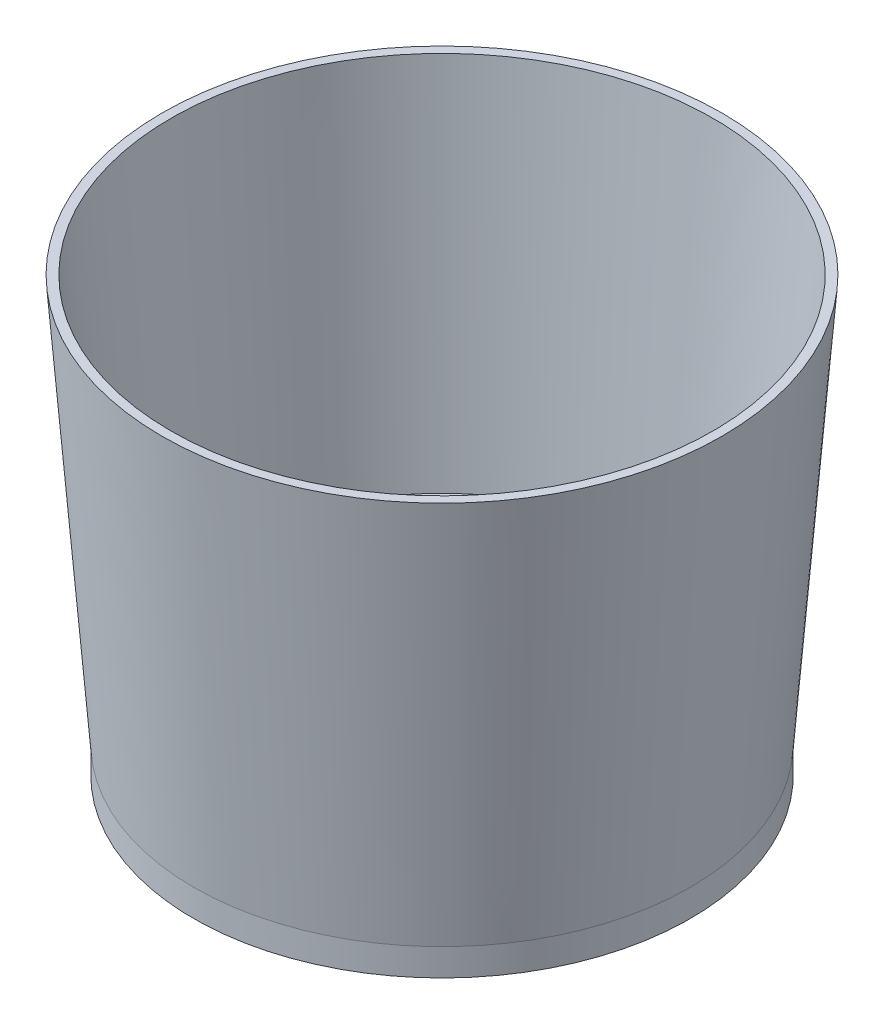
ISO-10303-21;
HEADER;
FILE_DESCRIPTION(('STEP AP214'),'2;1');
FILE_NAME('part.step','',(''),(''),'','','');
FILE_SCHEMA(('AUTOMOTIVE_DESIGN { 1 0 10303 214 1 1 1 1 }'));
ENDSEC;
DATA;
#1=APPLICATION_CONTEXT('core data for automotive mechanical design processes');
#2=APPLICATION_PROTOCOL_DEFINITION('international standard','automotive_design',2000,#1);
#3=PRODUCT_CONTEXT('',#1,'mechanical');
#4=PRODUCT('Part','Part','',(#3));
#5=PRODUCT_RELATED_PRODUCT_CATEGORY('part','',(#4));
#6=PRODUCT_DEFINITION_FORMATION('','',#4);
#7=PRODUCT_DEFINITION_CONTEXT('part definition',#1,'design');
#8=PRODUCT_DEFINITION('design','',#6,#7);
#9=PRODUCT_DEFINITION_SHAPE('','',#8);
#10=(LENGTH_UNIT() NAMED_UNIT(*) SI_UNIT(.MILLI.,.METRE.));
#11=(NAMED_UNIT(*) PLANE_ANGLE_UNIT() SI_UNIT($,.RADIAN.));
#12=(NAMED_UNIT(*) SI_UNIT($,.STERADIAN.) SOLID_ANGLE_UNIT());
#13=UNCERTAINTY_MEASURE_WITH_UNIT(LENGTH_MEASURE(1.E-05),#10,'distance_accuracy_value','');
#14=(GEOMETRIC_REPRESENTATION_CONTEXT(3) GLOBAL_UNCERTAINTY_ASSIGNED_CONTEXT((#13)) GLOBAL_UNIT_ASSIGNED_CONTEXT((#10,
#11,#12)) REPRESENTATION_CONTEXT('',''));
#15=CARTESIAN_POINT('',(0.,0.,0.));
#16=DIRECTION('',(0.,0.,1.));
#17=DIRECTION('',(1.,0.,0.));
#18=AXIS2_PLACEMENT_3D('',#15,#16,#17);
#19=CARTESIAN_POINT('',(0.,-3.,15.));
#20=DIRECTION('',(0.,1.,0.));
#21=DIRECTION('',(0.,0.,1.));
#22=AXIS2_PLACEMENT_3D('',#19,#20,#21);
#23=CYLINDRICAL_SURFACE('',#22,1.5);
#24=CARTESIAN_POINT('',(0.,-3.,15.));
#25=DIRECTION('',(0.,-1.,0.));
#26=DIRECTION('',(0.,0.,-1.));
#27=AXIS2_PLACEMENT_3D('',#24,#25,#26);
#28=CIRCLE('',#27,1.5);
#29=CARTESIAN_POINT('',(0.,-3.,13.5));
#30=VERTEX_POINT('',#29);
#31=EDGE_CURVE('E85',#30,#30,#28,.T.);
#32=ORIENTED_EDGE('',*,*,#31,.T.);
#33=EDGE_LOOP('',(#32));
#34=FACE_BOUND('',#33,.T.);
#35=CARTESIAN_POINT('',(0.,3.,15.));
#36=DIRECTION('',(0.,1.,0.));
#37=DIRECTION('',(0.,0.,1.));
#38=AXIS2_PLACEMENT_3D('',#35,#36,#37);
#39=CIRCLE('',#38,1.5);
#40=CARTESIAN_POINT('',(0.,3.,16.5));
#41=VERTEX_POINT('',#40);
#42=EDGE_CURVE('E39',#41,#41,#39,.T.);
#43=ORIENTED_EDGE('',*,*,#42,.T.);
#44=EDGE_LOOP('',(#43));
#45=FACE_BOUND('',#44,.T.);
#46=ADVANCED_FACE('F34',(#34,#45),#23,.F.);
#47=CARTESIAN_POINT('',(15.0000000000004,-3.,4.36324807897266E-13));
#48=DIRECTION('',(0.,1.,0.));
#49=DIRECTION('',(0.,0.,1.));
#50=AXIS2_PLACEMENT_3D('',#47,#48,#49);
#51=CYLINDRICAL_SURFACE('',#50,1.5);
#52=CARTESIAN_POINT('',(15.0000000000004,-3.,4.36324807897266E-13));
#53=DIRECTION('',(0.,-1.,0.));
#54=DIRECTION('',(0.,0.,-1.));
#55=AXIS2_PLACEMENT_3D('',#52,#53,#54);
#56=CIRCLE('',#55,1.5);
#57=CARTESIAN_POINT('',(15.0000000000004,-3.,-1.49999999999957));
#58=VERTEX_POINT('',#57);
#59=EDGE_CURVE('E82',#58,#58,#56,.T.);
#60=ORIENTED_EDGE('',*,*,#59,.T.);
#61=EDGE_LOOP('',(#60));
#62=FACE_BOUND('',#61,.T.);
#63=CARTESIAN_POINT('',(15.0000000000004,3.,4.36324807897266E-13));
#64=DIRECTION('',(0.,1.,0.));
#65=DIRECTION('',(0.,0.,1.));
#66=AXIS2_PLACEMENT_3D('',#63,#64,#65);
#67=CIRCLE('',#66,1.5);
#68=CARTESIAN_POINT('',(15.0000000000004,3.,1.50000000000044));
#69=VERTEX_POINT('',#68);
#70=EDGE_CURVE('E60',#69,#69,#67,.T.);
#71=ORIENTED_EDGE('',*,*,#70,.T.);
#72=EDGE_LOOP('',(#71));
#73=FACE_BOUND('',#72,.T.);
#74=ADVANCED_FACE('F164',(#62,#73),#51,.F.);
#75=CARTESIAN_POINT('',(8.72649615794532E-13,-3.,-15.));
#76=DIRECTION('',(0.,1.,0.));
#77=DIRECTION('',(0.,0.,1.));
#78=AXIS2_PLACEMENT_3D('',#75,#76,#77);
#79=CYLINDRICAL_SURFACE('',#78,1.5);
#80=CARTESIAN_POINT('',(8.72649615794532E-13,-3.,-15.));
#81=DIRECTION('',(0.,-1.,0.));
#82=DIRECTION('',(0.,0.,-1.));
#83=AXIS2_PLACEMENT_3D('',#80,#81,#82);
#84=CIRCLE('',#83,1.5);
#85=CARTESIAN_POINT('',(8.72649615794532E-13,-3.,-16.5));
#86=VERTEX_POINT('',#85);
#87=EDGE_CURVE('E74',#86,#86,#84,.T.);
#88=ORIENTED_EDGE('',*,*,#87,.T.);
#89=EDGE_LOOP('',(#88));
#90=FACE_BOUND('',#89,.T.);
#91=CARTESIAN_POINT('',(8.72649615794532E-13,3.,-15.));
#92=DIRECTION('',(0.,1.,0.));
#93=DIRECTION('',(0.,0.,1.));
#94=AXIS2_PLACEMENT_3D('',#91,#92,#93);
#95=CIRCLE('',#94,1.5);
#96=CARTESIAN_POINT('',(8.72649615794532E-13,3.,-13.5));
#97=VERTEX_POINT('',#96);
#98=EDGE_CURVE('E57',#97,#97,#95,.T.);
#99=ORIENTED_EDGE('',*,*,#98,.T.);
#100=EDGE_LOOP('',(#99));
#101=FACE_BOUND('',#100,.T.);
#102=ADVANCED_FACE('F168',(#90,#101),#79,.F.);
#103=CARTESIAN_POINT('',(-14.9999999999996,-3.,-4.38161778095987E-13));
#104=DIRECTION('',(0.,1.,0.));
#105=DIRECTION('',(0.,0.,1.));
#106=AXIS2_PLACEMENT_3D('',#103,#104,#105);
#107=CYLINDRICAL_SURFACE('',#106,1.5);
#108=CARTESIAN_POINT('',(-14.9999999999996,-3.,-4.38161778095987E-13));
#109=DIRECTION('',(0.,-1.,0.));
#110=DIRECTION('',(0.,0.,-1.));
#111=AXIS2_PLACEMENT_3D('',#108,#109,#110);
#112=CIRCLE('',#111,1.5);
#113=CARTESIAN_POINT('',(-14.9999999999996,-3.,-1.50000000000044));
#114=VERTEX_POINT('',#113);
#115=EDGE_CURVE('E69',#114,#114,#112,.T.);
#116=ORIENTED_EDGE('',*,*,#115,.T.);
#117=EDGE_LOOP('',(#116));
#118=FACE_BOUND('',#117,.T.);
#119=CARTESIAN_POINT('',(-14.9999999999996,3.,-4.38161778095987E-13));
#120=DIRECTION('',(0.,1.,0.));
#121=DIRECTION('',(0.,0.,1.));
#122=AXIS2_PLACEMENT_3D('',#119,#120,#121);
#123=CIRCLE('',#122,1.5);
#124=CARTESIAN_POINT('',(-14.9999999999996,3.,1.49999999999956));
#125=VERTEX_POINT('',#124);
#126=EDGE_CURVE('E54',#125,#125,#123,.T.);
#127=ORIENTED_EDGE('',*,*,#126,.T.);
#128=EDGE_LOOP('',(#127));
#129=FACE_BOUND('',#128,.T.);
#130=ADVANCED_FACE('F157',(#118,#129),#107,.F.);
#131=CARTESIAN_POINT('',(0.,0.,0.));
#132=DIRECTION('',(0.,-1.,0.));
#133=DIRECTION('',(0.,0.,-1.));
#134=AXIS2_PLACEMENT_3D('',#131,#132,#133);
#135=PLANE('',#134);
#136=CARTESIAN_POINT('',(0.,0.,0.));
#137=DIRECTION('',(0.,1.,0.));
#138=DIRECTION('',(0.,0.,1.));
#139=AXIS2_PLACEMENT_3D('',#136,#137,#138);
#140=CIRCLE('',#139,26.5);
#141=CARTESIAN_POINT('',(0.,0.,26.5));
#142=VERTEX_POINT('',#141);
#143=EDGE_CURVE('E48',#142,#142,#140,.T.);
#144=ORIENTED_EDGE('',*,*,#143,.T.);
#145=EDGE_LOOP('',(#144));
#146=FACE_BOUND('',#145,.T.);
#147=CARTESIAN_POINT('',(0.,0.,0.));
#148=DIRECTION('',(0.,-1.,0.));
#149=DIRECTION('',(0.,0.,-1.));
#150=AXIS2_PLACEMENT_3D('',#147,#148,#149);
#151=CIRCLE('',#150,25.5);
#152=CARTESIAN_POINT('',(0.,0.,-25.5));
#153=VERTEX_POINT('',#152);
#154=EDGE_CURVE('E11',#153,#153,#151,.F.);
#155=ORIENTED_EDGE('',*,*,#154,.F.);
#156=EDGE_LOOP('',(#155));
#157=FACE_BOUND('',#156,.T.);
#158=ADVANCED_FACE('F154',(#146,#157),#135,.F.);
#159=CARTESIAN_POINT('',(0.,45.,0.));
#160=DIRECTION('',(0.,1.,0.));
#161=DIRECTION('',(0.,0.,1.));
#162=AXIS2_PLACEMENT_3D('',#159,#160,#161);
#163=PLANE('',#162);
#164=CARTESIAN_POINT('',(0.,45.,0.));
#165=DIRECTION('',(0.,1.,0.));
#166=DIRECTION('',(0.,0.,1.));
#167=AXIS2_PLACEMENT_3D('',#164,#165,#166);
#168=CIRCLE('',#167,30.);
#169=CARTESIAN_POINT('',(0.,45.,30.));
#170=VERTEX_POINT('',#169);
#171=EDGE_CURVE('E92',#170,#170,#168,.T.);
#172=ORIENTED_EDGE('',*,*,#171,.F.);
#173=EDGE_LOOP('',(#172));
#174=FACE_BOUND('',#173,.T.);
#175=CARTESIAN_POINT('',(0.,45.,0.));
#176=DIRECTION('',(0.,1.,0.));
#177=DIRECTION('',(0.,0.,1.));
#178=AXIS2_PLACEMENT_3D('',#175,#176,#177);
#179=CIRCLE('',#178,31.);
#180=CARTESIAN_POINT('',(0.,45.,31.));
#181=VERTEX_POINT('',#180);
#182=EDGE_CURVE('E43',#181,#181,#179,.T.);
#183=ORIENTED_EDGE('',*,*,#182,.T.);
#184=EDGE_LOOP('',(#183));
#185=FACE_BOUND('',#184,.T.);
#186=ADVANCED_FACE('F36',(#174,#185),#163,.T.);
#187=CARTESIAN_POINT('',(0.,0.,0.));
#188=DIRECTION('',(0.,1.,0.));
#189=DIRECTION('',(0.,0.,1.));
#190=AXIS2_PLACEMENT_3D('',#187,#188,#189);
#191=CONICAL_SURFACE('',#190,27.5,0.0776215087373935);
#192=CARTESIAN_POINT('',(0.,0.,0.));
#193=DIRECTION('',(0.,-1.,0.));
#194=DIRECTION('',(0.,0.,-1.));
#195=AXIS2_PLACEMENT_3D('',#192,#193,#194);
#196=CIRCLE('',#195,27.5);
#197=CARTESIAN_POINT('',(0.,0.,-27.5));
#198=VERTEX_POINT('',#197);
#199=EDGE_CURVE('E88',#198,#198,#196,.T.);
#200=ORIENTED_EDGE('',*,*,#199,.F.);
#201=EDGE_LOOP('',(#200));
#202=FACE_BOUND('',#201,.T.);
#203=ORIENTED_EDGE('',*,*,#182,.F.);
#204=EDGE_LOOP('',(#203));
#205=FACE_BOUND('',#204,.T.);
#206=ADVANCED_FACE('F106',(#202,#205),#191,.T.);
#207=CARTESIAN_POINT('',(0.,0.,0.));
#208=DIRECTION('',(0.,1.,0.));
#209=DIRECTION('',(0.,0.,1.));
#210=AXIS2_PLACEMENT_3D('',#207,#208,#209);
#211=CONICAL_SURFACE('',#210,26.5,0.0776215087373934);
#212=ORIENTED_EDGE('',*,*,#171,.T.);
#213=EDGE_LOOP('',(#212));
#214=FACE_BOUND('',#213,.T.);
#215=ORIENTED_EDGE('',*,*,#143,.F.);
#216=EDGE_LOOP('',(#215));
#217=FACE_BOUND('',#216,.T.);
#218=ADVANCED_FACE('F115',(#214,#217),#211,.F.);
#219=CARTESIAN_POINT('',(0.,-3.,0.));
#220=DIRECTION('',(0.,-1.,0.));
#221=DIRECTION('',(0.,0.,-1.));
#222=AXIS2_PLACEMENT_3D('',#219,#220,#221);
#223=PLANE('',#222);
#224=ORIENTED_EDGE('',*,*,#87,.F.);
#225=EDGE_LOOP('',(#224));
#226=FACE_BOUND('',#225,.T.);
#227=ORIENTED_EDGE('',*,*,#31,.F.);
#228=EDGE_LOOP('',(#227));
#229=FACE_BOUND('',#228,.T.);
#230=CARTESIAN_POINT('',(0.,-3.,0.));
#231=DIRECTION('',(0.,-1.,0.));
#232=DIRECTION('',(0.,0.,-1.));
#233=AXIS2_PLACEMENT_3D('',#230,#231,#232);
#234=CIRCLE('',#233,27.5);
#235=CARTESIAN_POINT('',(0.,-3.,-27.5));
#236=VERTEX_POINT('',#235);
#237=EDGE_CURVE('E89',#236,#236,#234,.T.);
#238=ORIENTED_EDGE('',*,*,#237,.T.);
#239=EDGE_LOOP('',(#238));
#240=FACE_BOUND('',#239,.T.);
#241=ORIENTED_EDGE('',*,*,#59,.F.);
#242=EDGE_LOOP('',(#241));
#243=FACE_BOUND('',#242,.T.);
#244=ORIENTED_EDGE('',*,*,#115,.F.);
#245=EDGE_LOOP('',(#244));
#246=FACE_BOUND('',#245,.T.);
#247=ADVANCED_FACE('F152',(#226,#229,#240,#243,#246),#223,.T.);
#248=CARTESIAN_POINT('',(0.,-3.,0.));
#249=DIRECTION('',(0.,1.,0.));
#250=DIRECTION('',(0.,0.,1.));
#251=AXIS2_PLACEMENT_3D('',#248,#249,#250);
#252=CYLINDRICAL_SURFACE('',#251,27.5);
#253=ORIENTED_EDGE('',*,*,#237,.F.);
#254=EDGE_LOOP('',(#253));
#255=FACE_BOUND('',#254,.T.);
#256=ORIENTED_EDGE('',*,*,#199,.T.);
#257=EDGE_LOOP('',(#256));
#258=FACE_BOUND('',#257,.T.);
#259=ADVANCED_FACE('F142',(#255,#258),#252,.T.);
#260=CARTESIAN_POINT('',(0.,6.,0.));
#261=DIRECTION('',(0.,1.,0.));
#262=DIRECTION('',(0.,0.,1.));
#263=AXIS2_PLACEMENT_3D('',#260,#261,#262);
#264=PLANE('',#263);
#265=CARTESIAN_POINT('',(8.72649615794532E-13,6.,-15.));
#266=DIRECTION('',(0.,1.,0.));
#267=DIRECTION('',(0.,0.,1.));
#268=AXIS2_PLACEMENT_3D('',#265,#266,#267);
#269=CIRCLE('',#268,3.5);
#270=CARTESIAN_POINT('',(8.72649615794532E-13,6.,-11.5));
#271=VERTEX_POINT('',#270);
#272=EDGE_CURVE('E220',#271,#271,#269,.T.);
#273=ORIENTED_EDGE('',*,*,#272,.F.);
#274=EDGE_LOOP('',(#273));
#275=FACE_BOUND('',#274,.T.);
#276=CARTESIAN_POINT('',(15.0000000000004,6.,4.54807964245785E-13));
#277=DIRECTION('',(0.,1.,0.));
#278=DIRECTION('',(0.,0.,1.));
#279=AXIS2_PLACEMENT_3D('',#276,#277,#278);
#280=CIRCLE('',#279,3.50000000000033);
#281=CARTESIAN_POINT('',(15.0000000000004,6.,3.50000000000078));
#282=VERTEX_POINT('',#281);
#283=EDGE_CURVE('E228',#282,#282,#280,.T.);
#284=ORIENTED_EDGE('',*,*,#283,.F.);
#285=EDGE_LOOP('',(#284));
#286=FACE_BOUND('',#285,.T.);
#287=CARTESIAN_POINT('',(0.,6.,15.));
#288=DIRECTION('',(0.,1.,0.));
#289=DIRECTION('',(0.,0.,1.));
#290=AXIS2_PLACEMENT_3D('',#287,#288,#289);
#291=CIRCLE('',#290,3.5000000000009);
#292=CARTESIAN_POINT('',(0.,6.,18.5000000000009));
#293=VERTEX_POINT('',#292);
#294=EDGE_CURVE('E234',#293,#293,#291,.T.);
#295=ORIENTED_EDGE('',*,*,#294,.F.);
#296=EDGE_LOOP('',(#295));
#297=FACE_BOUND('',#296,.T.);
#298=CARTESIAN_POINT('',(-14.9999999999996,6.,-4.52970994047064E-13));
#299=DIRECTION('',(0.,1.,0.));
#300=DIRECTION('',(0.,0.,1.));
#301=AXIS2_PLACEMENT_3D('',#298,#299,#300);
#302=CIRCLE('',#301,3.50000000000067);
#303=CARTESIAN_POINT('',(-14.9999999999996,6.,3.50000000000022));
#304=VERTEX_POINT('',#303);
#305=EDGE_CURVE('E77',#304,#304,#302,.T.);
#306=ORIENTED_EDGE('',*,*,#305,.F.);
#307=EDGE_LOOP('',(#306));
#308=FACE_BOUND('',#307,.T.);
#309=CARTESIAN_POINT('',(0.,6.,0.));
#310=DIRECTION('',(0.,1.,0.));
#311=DIRECTION('',(0.,0.,1.));
#312=AXIS2_PLACEMENT_3D('',#309,#310,#311);
#313=CIRCLE('',#312,25.5);
#314=CARTESIAN_POINT('',(0.,6.,25.5));
#315=VERTEX_POINT('',#314);
#316=EDGE_CURVE('E65',#315,#315,#313,.T.);
#317=ORIENTED_EDGE('',*,*,#316,.T.);
#318=EDGE_LOOP('',(#317));
#319=FACE_BOUND('',#318,.T.);
#320=ADVANCED_FACE('F151',(#275,#286,#297,#308,#319),#264,.T.);
#321=CARTESIAN_POINT('',(0.,6.,0.));
#322=DIRECTION('',(0.,-1.,0.));
#323=DIRECTION('',(0.,0.,-1.));
#324=AXIS2_PLACEMENT_3D('',#321,#322,#323);
#325=CYLINDRICAL_SURFACE('',#324,25.5);
#326=ORIENTED_EDGE('',*,*,#316,.F.);
#327=EDGE_LOOP('',(#326));
#328=FACE_BOUND('',#327,.T.);
#329=ORIENTED_EDGE('',*,*,#154,.T.);
#330=EDGE_LOOP('',(#329));
#331=FACE_BOUND('',#330,.T.);
#332=ADVANCED_FACE('F176',(#328,#331),#325,.T.);
#333=CARTESIAN_POINT('',(-14.9999999999996,3.,-4.52970994047064E-13));
#334=DIRECTION('',(0.,1.,0.));
#335=DIRECTION('',(0.,0.,1.));
#336=AXIS2_PLACEMENT_3D('',#333,#334,#335);
#337=CYLINDRICAL_SURFACE('',#336,3.50000000000067);
#338=CARTESIAN_POINT('',(-14.9999999999996,3.,-4.52970994047064E-13));
#339=DIRECTION('',(0.,1.,0.));
#340=DIRECTION('',(0.,0.,1.));
#341=AXIS2_PLACEMENT_3D('',#338,#339,#340);
#342=CIRCLE('',#341,3.50000000000067);
#343=CARTESIAN_POINT('',(-14.9999999999996,3.,3.50000000000022));
#344=VERTEX_POINT('',#343);
#345=EDGE_CURVE('E236',#344,#344,#342,.T.);
#346=ORIENTED_EDGE('',*,*,#345,.F.);
#347=EDGE_LOOP('',(#346));
#348=FACE_BOUND('',#347,.T.);
#349=ORIENTED_EDGE('',*,*,#305,.T.);
#350=EDGE_LOOP('',(#349));
#351=FACE_BOUND('',#350,.T.);
#352=ADVANCED_FACE('F179',(#348,#351),#337,.F.);
#353=CARTESIAN_POINT('',(-14.9999999999996,3.,-4.52970994047064E-13));
#354=DIRECTION('',(0.,1.,0.));
#355=DIRECTION('',(0.,0.,1.));
#356=AXIS2_PLACEMENT_3D('',#353,#354,#355);
#357=PLANE('',#356);
#358=ORIENTED_EDGE('',*,*,#126,.F.);
#359=EDGE_LOOP('',(#358));
#360=FACE_BOUND('',#359,.T.);
#361=ORIENTED_EDGE('',*,*,#345,.T.);
#362=EDGE_LOOP('',(#361));
#363=FACE_BOUND('',#362,.T.);
#364=ADVANCED_FACE('F186',(#360,#363),#357,.T.);
#365=CARTESIAN_POINT('',(0.,3.,15.));
#366=DIRECTION('',(0.,1.,0.));
#367=DIRECTION('',(0.,0.,1.));
#368=AXIS2_PLACEMENT_3D('',#365,#366,#367);
#369=CYLINDRICAL_SURFACE('',#368,3.5000000000009);
#370=CARTESIAN_POINT('',(0.,3.,15.));
#371=DIRECTION('',(0.,1.,0.));
#372=DIRECTION('',(0.,0.,1.));
#373=AXIS2_PLACEMENT_3D('',#370,#371,#372);
#374=CIRCLE('',#373,3.5000000000009);
#375=CARTESIAN_POINT('',(0.,3.,18.5000000000009));
#376=VERTEX_POINT('',#375);
#377=EDGE_CURVE('E231',#376,#376,#374,.T.);
#378=ORIENTED_EDGE('',*,*,#377,.F.);
#379=EDGE_LOOP('',(#378));
#380=FACE_BOUND('',#379,.T.);
#381=ORIENTED_EDGE('',*,*,#294,.T.);
#382=EDGE_LOOP('',(#381));
#383=FACE_BOUND('',#382,.T.);
#384=ADVANCED_FACE('F190',(#380,#383),#369,.F.);
#385=CARTESIAN_POINT('',(0.,3.,15.));
#386=DIRECTION('',(0.,1.,0.));
#387=DIRECTION('',(0.,0.,1.));
#388=AXIS2_PLACEMENT_3D('',#385,#386,#387);
#389=PLANE('',#388);
#390=ORIENTED_EDGE('',*,*,#42,.F.);
#391=EDGE_LOOP('',(#390));
#392=FACE_BOUND('',#391,.T.);
#393=ORIENTED_EDGE('',*,*,#377,.T.);
#394=EDGE_LOOP('',(#393));
#395=FACE_BOUND('',#394,.T.);
#396=ADVANCED_FACE('F194',(#392,#395),#389,.T.);
#397=CARTESIAN_POINT('',(15.0000000000004,3.,4.54807964245785E-13));
#398=DIRECTION('',(0.,1.,0.));
#399=DIRECTION('',(0.,0.,1.));
#400=AXIS2_PLACEMENT_3D('',#397,#398,#399);
#401=CYLINDRICAL_SURFACE('',#400,3.50000000000033);
#402=CARTESIAN_POINT('',(15.0000000000004,3.,4.54807964245785E-13));
#403=DIRECTION('',(0.,1.,0.));
#404=DIRECTION('',(0.,0.,1.));
#405=AXIS2_PLACEMENT_3D('',#402,#403,#404);
#406=CIRCLE('',#405,3.50000000000033);
#407=CARTESIAN_POINT('',(15.0000000000004,3.,3.50000000000078));
#408=VERTEX_POINT('',#407);
#409=EDGE_CURVE('E223',#408,#408,#406,.T.);
#410=ORIENTED_EDGE('',*,*,#409,.F.);
#411=EDGE_LOOP('',(#410));
#412=FACE_BOUND('',#411,.T.);
#413=ORIENTED_EDGE('',*,*,#283,.T.);
#414=EDGE_LOOP('',(#413));
#415=FACE_BOUND('',#414,.T.);
#416=ADVANCED_FACE('F198',(#412,#415),#401,.F.);
#417=CARTESIAN_POINT('',(15.0000000000004,3.,4.54807964245785E-13));
#418=DIRECTION('',(0.,1.,0.));
#419=DIRECTION('',(0.,0.,1.));
#420=AXIS2_PLACEMENT_3D('',#417,#418,#419);
#421=PLANE('',#420);
#422=ORIENTED_EDGE('',*,*,#70,.F.);
#423=EDGE_LOOP('',(#422));
#424=FACE_BOUND('',#423,.T.);
#425=ORIENTED_EDGE('',*,*,#409,.T.);
#426=EDGE_LOOP('',(#425));
#427=FACE_BOUND('',#426,.T.);
#428=ADVANCED_FACE('F202',(#424,#427),#421,.T.);
#429=CARTESIAN_POINT('',(8.72649615794532E-13,3.,-15.));
#430=DIRECTION('',(0.,1.,0.));
#431=DIRECTION('',(0.,0.,1.));
#432=AXIS2_PLACEMENT_3D('',#429,#430,#431);
#433=CYLINDRICAL_SURFACE('',#432,3.5);
#434=CARTESIAN_POINT('',(8.72649615794532E-13,3.,-15.));
#435=DIRECTION('',(0.,1.,0.));
#436=DIRECTION('',(0.,0.,1.));
#437=AXIS2_PLACEMENT_3D('',#434,#435,#436);
#438=CIRCLE('',#437,3.5);
#439=CARTESIAN_POINT('',(8.72649615794532E-13,3.,-11.5));
#440=VERTEX_POINT('',#439);
#441=EDGE_CURVE('E58',#440,#440,#438,.T.);
#442=ORIENTED_EDGE('',*,*,#441,.F.);
#443=EDGE_LOOP('',(#442));
#444=FACE_BOUND('',#443,.T.);
#445=ORIENTED_EDGE('',*,*,#272,.T.);
#446=EDGE_LOOP('',(#445));
#447=FACE_BOUND('',#446,.T.);
#448=ADVANCED_FACE('F206',(#444,#447),#433,.F.);
#449=CARTESIAN_POINT('',(8.72649615794532E-13,3.,-15.));
#450=DIRECTION('',(0.,1.,0.));
#451=DIRECTION('',(0.,0.,1.));
#452=AXIS2_PLACEMENT_3D('',#449,#450,#451);
#453=PLANE('',#452);
#454=ORIENTED_EDGE('',*,*,#98,.F.);
#455=EDGE_LOOP('',(#454));
#456=FACE_BOUND('',#455,.T.);
#457=ORIENTED_EDGE('',*,*,#441,.T.);
#458=EDGE_LOOP('',(#457));
#459=FACE_BOUND('',#458,.T.);
#460=ADVANCED_FACE('F210',(#456,#459),#453,.T.);
#461=CLOSED_SHELL('',(#46,#74,#102,#130,#158,#186,#206,#218,#247,#259,#320,#332,#352,#364,#384,
#396,#416,#428,#448,#460));
#462=MANIFOLD_SOLID_BREP('B2',#461);
#463=ADVANCED_BREP_SHAPE_REPRESENTATION('',(#18,#462),#14);
#464=SHAPE_DEFINITION_REPRESENTATION(#9,#463);
ENDSEC;
END-ISO-10303-21;
